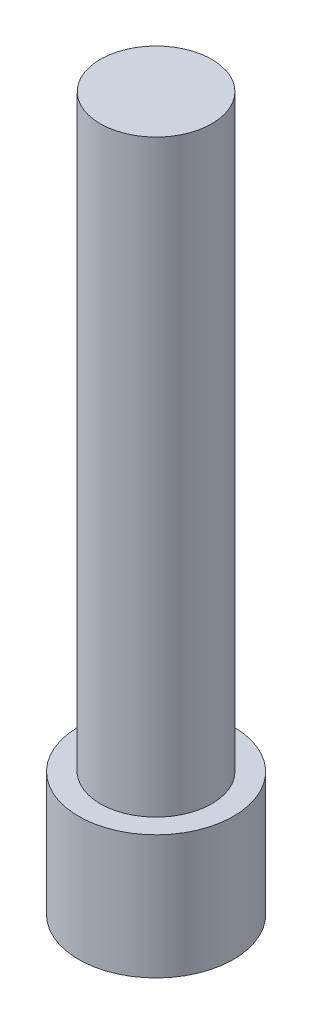
ISO-10303-21;
HEADER;
FILE_DESCRIPTION(('STEP AP214'),'2;1');
FILE_NAME('part.step','',(''),(''),'','','');
FILE_SCHEMA(('AUTOMOTIVE_DESIGN { 1 0 10303 214 1 1 1 1 }'));
ENDSEC;
DATA;
#1=APPLICATION_CONTEXT('core data for automotive mechanical design processes');
#2=APPLICATION_PROTOCOL_DEFINITION('international standard','automotive_design',2000,#1);
#3=PRODUCT_CONTEXT('',#1,'mechanical');
#4=PRODUCT('Part','Part','',(#3));
#5=PRODUCT_RELATED_PRODUCT_CATEGORY('part','',(#4));
#6=PRODUCT_DEFINITION_FORMATION('','',#4);
#7=PRODUCT_DEFINITION_CONTEXT('part definition',#1,'design');
#8=PRODUCT_DEFINITION('design','',#6,#7);
#9=PRODUCT_DEFINITION_SHAPE('','',#8);
#10=(LENGTH_UNIT() NAMED_UNIT(*) SI_UNIT(.MILLI.,.METRE.));
#11=(NAMED_UNIT(*) PLANE_ANGLE_UNIT() SI_UNIT($,.RADIAN.));
#12=(NAMED_UNIT(*) SI_UNIT($,.STERADIAN.) SOLID_ANGLE_UNIT());
#13=UNCERTAINTY_MEASURE_WITH_UNIT(LENGTH_MEASURE(1.E-05),#10,'distance_accuracy_value','');
#14=(GEOMETRIC_REPRESENTATION_CONTEXT(3) GLOBAL_UNCERTAINTY_ASSIGNED_CONTEXT((#13)) GLOBAL_UNIT_ASSIGNED_CONTEXT((#10,
#11,#12)) REPRESENTATION_CONTEXT('',''));
#15=CARTESIAN_POINT('',(0.,0.,0.));
#16=DIRECTION('',(0.,0.,1.));
#17=DIRECTION('',(1.,0.,0.));
#18=AXIS2_PLACEMENT_3D('',#15,#16,#17);
#19=CARTESIAN_POINT('',(0.,9.5,0.));
#20=DIRECTION('',(0.,-1.,0.));
#21=DIRECTION('',(0.,0.,-1.));
#22=AXIS2_PLACEMENT_3D('',#19,#20,#21);
#23=CYLINDRICAL_SURFACE('',#22,0.9);
#24=CARTESIAN_POINT('',(0.,9.5,0.));
#25=DIRECTION('',(0.,1.,0.));
#26=DIRECTION('',(0.,0.,1.));
#27=AXIS2_PLACEMENT_3D('',#24,#25,#26);
#28=CIRCLE('',#27,0.9);
#29=CARTESIAN_POINT('',(0.,9.5,0.9));
#30=VERTEX_POINT('',#29);
#31=EDGE_CURVE('E10',#30,#30,#28,.T.);
#32=ORIENTED_EDGE('',*,*,#31,.F.);
#33=EDGE_LOOP('',(#32));
#34=FACE_BOUND('',#33,.T.);
#35=CARTESIAN_POINT('',(0.,0.,0.));
#36=DIRECTION('',(0.,1.,0.));
#37=DIRECTION('',(0.,0.,1.));
#38=AXIS2_PLACEMENT_3D('',#35,#36,#37);
#39=CIRCLE('',#38,0.9);
#40=CARTESIAN_POINT('',(0.,0.,0.9));
#41=VERTEX_POINT('',#40);
#42=EDGE_CURVE('E46',#41,#41,#39,.T.);
#43=ORIENTED_EDGE('',*,*,#42,.T.);
#44=EDGE_LOOP('',(#43));
#45=FACE_BOUND('',#44,.T.);
#46=ADVANCED_FACE('F43',(#34,#45),#23,.T.);
#47=CARTESIAN_POINT('',(0.,9.5,0.));
#48=DIRECTION('',(0.,1.,0.));
#49=DIRECTION('',(0.,0.,1.));
#50=AXIS2_PLACEMENT_3D('',#47,#48,#49);
#51=PLANE('',#50);
#52=ORIENTED_EDGE('',*,*,#31,.T.);
#53=EDGE_LOOP('',(#52));
#54=FACE_BOUND('',#53,.T.);
#55=ADVANCED_FACE('F70',(#54),#51,.T.);
#56=CARTESIAN_POINT('',(0.,-2.,0.));
#57=DIRECTION('',(0.,1.,0.));
#58=DIRECTION('',(0.,0.,1.));
#59=AXIS2_PLACEMENT_3D('',#56,#57,#58);
#60=CYLINDRICAL_SURFACE('',#59,1.25);
#61=CARTESIAN_POINT('',(0.,-2.,0.));
#62=DIRECTION('',(0.,-1.,0.));
#63=DIRECTION('',(0.,0.,-1.));
#64=AXIS2_PLACEMENT_3D('',#61,#62,#63);
#65=CIRCLE('',#64,1.25);
#66=CARTESIAN_POINT('',(0.,-2.,-1.25));
#67=VERTEX_POINT('',#66);
#68=EDGE_CURVE('E55',#67,#67,#65,.T.);
#69=ORIENTED_EDGE('',*,*,#68,.F.);
#70=EDGE_LOOP('',(#69));
#71=FACE_BOUND('',#70,.T.);
#72=CARTESIAN_POINT('',(0.,0.,0.));
#73=DIRECTION('',(0.,-1.,0.));
#74=DIRECTION('',(0.,0.,-1.));
#75=AXIS2_PLACEMENT_3D('',#72,#73,#74);
#76=CIRCLE('',#75,1.25);
#77=CARTESIAN_POINT('',(0.,0.,-1.25));
#78=VERTEX_POINT('',#77);
#79=EDGE_CURVE('E57',#78,#78,#76,.T.);
#80=ORIENTED_EDGE('',*,*,#79,.T.);
#81=EDGE_LOOP('',(#80));
#82=FACE_BOUND('',#81,.T.);
#83=ADVANCED_FACE('F67',(#71,#82),#60,.T.);
#84=CARTESIAN_POINT('',(0.,-2.,0.));
#85=DIRECTION('',(0.,-1.,0.));
#86=DIRECTION('',(0.,0.,-1.));
#87=AXIS2_PLACEMENT_3D('',#84,#85,#86);
#88=PLANE('',#87);
#89=ORIENTED_EDGE('',*,*,#68,.T.);
#90=EDGE_LOOP('',(#89));
#91=FACE_BOUND('',#90,.T.);
#92=ADVANCED_FACE('F65',(#91),#88,.T.);
#93=CARTESIAN_POINT('',(0.,0.,0.));
#94=DIRECTION('',(0.,-1.,0.));
#95=DIRECTION('',(0.,0.,-1.));
#96=AXIS2_PLACEMENT_3D('',#93,#94,#95);
#97=PLANE('',#96);
#98=ORIENTED_EDGE('',*,*,#42,.F.);
#99=EDGE_LOOP('',(#98));
#100=FACE_BOUND('',#99,.T.);
#101=ORIENTED_EDGE('',*,*,#79,.F.);
#102=EDGE_LOOP('',(#101));
#103=FACE_BOUND('',#102,.T.);
#104=ADVANCED_FACE('F74',(#100,#103),#97,.F.);
#105=CLOSED_SHELL('',(#46,#55,#83,#92,#104));
#106=MANIFOLD_SOLID_BREP('B2',#105);
#107=ADVANCED_BREP_SHAPE_REPRESENTATION('',(#18,#106),#14);
#108=SHAPE_DEFINITION_REPRESENTATION(#9,#107);
ENDSEC;
END-ISO-10303-21;
